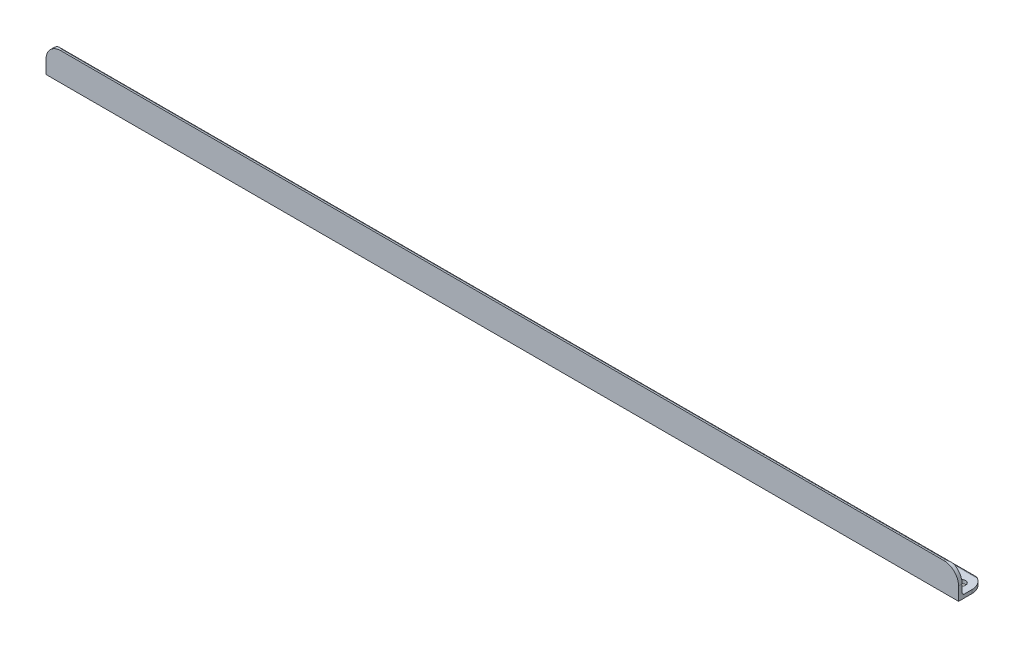
ISO-10303-21;
HEADER;
FILE_DESCRIPTION(('STEP AP214'),'2;1');
FILE_NAME('part.step','',(''),(''),'','','');
FILE_SCHEMA(('AUTOMOTIVE_DESIGN { 1 0 10303 214 1 1 1 1 }'));
ENDSEC;
DATA;
#1=APPLICATION_CONTEXT('core data for automotive mechanical design processes');
#2=APPLICATION_PROTOCOL_DEFINITION('international standard','automotive_design',2000,#1);
#3=PRODUCT_CONTEXT('',#1,'mechanical');
#4=PRODUCT('Part','Part','',(#3));
#5=PRODUCT_RELATED_PRODUCT_CATEGORY('part','',(#4));
#6=PRODUCT_DEFINITION_FORMATION('','',#4);
#7=PRODUCT_DEFINITION_CONTEXT('part definition',#1,'design');
#8=PRODUCT_DEFINITION('design','',#6,#7);
#9=PRODUCT_DEFINITION_SHAPE('','',#8);
#10=(LENGTH_UNIT() NAMED_UNIT(*) SI_UNIT(.MILLI.,.METRE.));
#11=(NAMED_UNIT(*) PLANE_ANGLE_UNIT() SI_UNIT($,.RADIAN.));
#12=(NAMED_UNIT(*) SI_UNIT($,.STERADIAN.) SOLID_ANGLE_UNIT());
#13=UNCERTAINTY_MEASURE_WITH_UNIT(LENGTH_MEASURE(1.E-05),#10,'distance_accuracy_value','');
#14=(GEOMETRIC_REPRESENTATION_CONTEXT(3) GLOBAL_UNCERTAINTY_ASSIGNED_CONTEXT((#13)) GLOBAL_UNIT_ASSIGNED_CONTEXT((#10,
#11,#12)) REPRESENTATION_CONTEXT('',''));
#15=CARTESIAN_POINT('',(0.,0.,0.));
#16=DIRECTION('',(0.,0.,1.));
#17=DIRECTION('',(1.,0.,0.));
#18=AXIS2_PLACEMENT_3D('',#15,#16,#17);
#19=CARTESIAN_POINT('',(0.,-308.926572168843,-687.15));
#20=DIRECTION('',(-1.,0.,0.));
#21=DIRECTION('',(0.,0.,1.));
#22=AXIS2_PLACEMENT_3D('',#19,#20,#21);
#23=CYLINDRICAL_SURFACE('',#22,3.);
#24=CARTESIAN_POINT('',(358.410652388511,-308.926572168843,-690.15));
#25=CARTESIAN_POINT('',(358.410652403078,-308.926437263091,-690.15));
#26=CARTESIAN_POINT('',(358.411226064356,-308.926302357476,-690.149999990929));
#27=CARTESIAN_POINT('',(358.412578827522,-308.925913595122,-690.149999938682));
#28=CARTESIAN_POINT('',(358.413093590989,-308.925659662431,-690.149999872498));
#29=CARTESIAN_POINT('',(358.415295059486,-308.924670176406,-690.149999488983));
#30=CARTESIAN_POINT('',(358.417349493874,-308.923936649768,-690.149998933404));
#31=CARTESIAN_POINT('',(358.425570360576,-308.920923996021,-690.149995544504));
#32=CARTESIAN_POINT('',(358.431292738453,-308.918640485262,-690.149990378275));
#33=CARTESIAN_POINT('',(358.561639886978,-308.866741766351,-690.14981378427));
#34=CARTESIAN_POINT('',(358.692151762047,-308.817186350619,-690.148415798466));
#35=CARTESIAN_POINT('',(358.951954031309,-308.717389544675,-690.143121117783));
#36=CARTESIAN_POINT('',(359.081196543137,-308.667149045249,-690.139187163657));
#37=CARTESIAN_POINT('',(359.334945021709,-308.569018272874,-690.129007200066));
#38=CARTESIAN_POINT('',(359.45941499064,-308.521120051199,-690.122868173072));
#39=CARTESIAN_POINT('',(359.70759930398,-308.425754346051,-690.108293166531));
#40=CARTESIAN_POINT('',(359.831314683702,-308.37828590688,-690.099866430289));
#41=CARTESIAN_POINT('',(360.093725642345,-308.277938610166,-690.079539760976));
#42=CARTESIAN_POINT('',(360.232421041461,-308.225100673362,-690.067342806503));
#43=CARTESIAN_POINT('',(360.509853723203,-308.119880032101,-690.040018251834));
#44=CARTESIAN_POINT('',(360.648590878856,-308.067497903577,-690.024887385659));
#45=CARTESIAN_POINT('',(361.067354590758,-307.910275182757,-689.974769466624));
#46=CARTESIAN_POINT('',(361.347226577094,-307.806397543196,-689.935265634876));
#47=CARTESIAN_POINT('',(361.834467968356,-307.628457333192,-689.855881895473));
#48=CARTESIAN_POINT('',(362.041991690463,-307.553591183282,-689.818705967165));
#49=CARTESIAN_POINT('',(362.456080531994,-307.406466396023,-689.737723339041));
#50=CARTESIAN_POINT('',(362.662646753219,-307.334201779432,-689.693933230144));
#51=CARTESIAN_POINT('',(363.07069936939,-307.194127447148,-689.600624604074));
#52=CARTESIAN_POINT('',(363.272197677177,-307.126254742717,-689.551253048669));
#53=CARTESIAN_POINT('',(363.674679870333,-306.993744234859,-689.445940339067));
#54=CARTESIAN_POINT('',(363.875663369394,-306.929108419204,-689.389995216922));
#55=CARTESIAN_POINT('',(364.402900018081,-306.76425609345,-689.234259299802));
#56=CARTESIAN_POINT('',(364.728551789939,-306.66718840543,-689.128998538735));
#57=CARTESIAN_POINT('',(365.379091554621,-306.485426411079,-688.899945408181));
#58=CARTESIAN_POINT('',(365.703964053806,-306.400807458617,-688.776048682408));
#59=CARTESIAN_POINT('',(366.366800259518,-306.24417125723,-688.50305770582));
#60=CARTESIAN_POINT('',(366.704575158252,-306.173028850699,-688.352993557573));
#61=CARTESIAN_POINT('',(367.374077169076,-306.054326965937,-688.032792518766));
#62=CARTESIAN_POINT('',(367.70581524284,-306.006719525515,-687.86269733351));
#63=CARTESIAN_POINT('',(368.204434472241,-305.957347164322,-687.589032792718));
#64=CARTESIAN_POINT('',(368.374189018764,-305.944546808887,-687.49261098118));
#65=CARTESIAN_POINT('',(368.711200863383,-305.928410432382,-687.294587438534));
#66=CARTESIAN_POINT('',(368.878457566624,-305.925076631092,-687.192984498206));
#67=CARTESIAN_POINT('',(369.208158806163,-305.929287855301,-686.986013812622));
#68=CARTESIAN_POINT('',(369.370634888223,-305.936723309026,-686.880694475626));
#69=CARTESIAN_POINT('',(369.691743724046,-305.96391330731,-686.665878801566));
#70=CARTESIAN_POINT('',(369.850377618847,-305.983664146717,-686.556383730095));
#71=CARTESIAN_POINT('',(370.126286359075,-306.031120332089,-686.360043726743));
#72=CARTESIAN_POINT('',(370.244558090304,-306.05588547665,-686.273889803283));
#73=CARTESIAN_POINT('',(370.477719874666,-306.114773104166,-686.100141447359));
#74=CARTESIAN_POINT('',(370.592609582333,-306.148896539402,-686.012546869149));
#75=CARTESIAN_POINT('',(370.818313625606,-306.227617987433,-685.836631652883));
#76=CARTESIAN_POINT('',(370.929125959732,-306.272221067135,-685.748310683613));
#77=CARTESIAN_POINT('',(371.145603036253,-306.373052177799,-685.572078824085));
#78=CARTESIAN_POINT('',(371.25127030228,-306.429274437167,-685.484167752305));
#79=CARTESIAN_POINT('',(371.487156851712,-306.573443170257,-685.283919720945));
#80=CARTESIAN_POINT('',(371.615222417408,-306.665846422688,-685.172173749267));
#81=CARTESIAN_POINT('',(371.857036078994,-306.87489656912,-684.956112592106));
#82=CARTESIAN_POINT('',(371.970806712981,-306.991504510863,-684.8517858248));
#83=CARTESIAN_POINT('',(372.157570913495,-307.223356857877,-684.677046187799));
#84=CARTESIAN_POINT('',(372.234118351555,-307.333800252626,-684.604100865757));
#85=CARTESIAN_POINT('',(372.372384114512,-307.570422854135,-684.470589218278));
#86=CARTESIAN_POINT('',(372.434118447102,-307.696584848568,-684.410009540655));
#87=CARTESIAN_POINT('',(372.531312371563,-307.941680221377,-684.313718101158));
#88=CARTESIAN_POINT('',(372.569378420279,-308.058624487246,-684.275592750962));
#89=CARTESIAN_POINT('',(372.631013935831,-308.299909681263,-684.213543245217));
#90=CARTESIAN_POINT('',(372.654590224916,-308.424247098184,-684.189612406617));
#91=CARTESIAN_POINT('',(372.686038296547,-308.677395395987,-684.15763653702));
#92=CARTESIAN_POINT('',(372.69385319976,-308.806220778391,-684.149649043071));
#93=CARTESIAN_POINT('',(372.693142090806,-309.063776822499,-684.15037462628));
#94=CARTESIAN_POINT('',(372.684617250559,-309.192507490333,-684.159086505725));
#95=CARTESIAN_POINT('',(372.652737328202,-309.438088279606,-684.191491191099));
#96=CARTESIAN_POINT('',(372.630307466113,-309.555186731039,-684.214249011077));
#97=CARTESIAN_POINT('',(372.572561855696,-309.782838128552,-684.272393109109));
#98=CARTESIAN_POINT('',(372.53724452274,-309.893390267761,-684.307780940122));
#99=CARTESIAN_POINT('',(372.452518696014,-310.11282369889,-684.391831023984));
#100=CARTESIAN_POINT('',(372.402346055281,-310.221133618356,-684.44120426048));
#101=CARTESIAN_POINT('',(372.290964824114,-310.426721795211,-684.549408766332));
#102=CARTESIAN_POINT('',(372.229750646818,-310.523994427112,-684.6082448221));
#103=CARTESIAN_POINT('',(372.063530270281,-310.755091977686,-684.765672849704));
#104=CARTESIAN_POINT('',(371.952392109448,-310.881338729401,-684.868934300186));
#105=CARTESIAN_POINT('',(371.713967028328,-311.108210204874,-685.084784805859));
#106=CARTESIAN_POINT('',(371.586636844829,-311.208764030448,-685.197398558858));
#107=CARTESIAN_POINT('',(371.354926335459,-311.363273130904,-685.396728618486));
#108=CARTESIAN_POINT('',(371.253219418852,-311.422542221842,-685.482540759611));
#109=CARTESIAN_POINT('',(371.044484405506,-311.529500682257,-685.654986566195));
#110=CARTESIAN_POINT('',(370.937453745235,-311.577184406735,-685.741620610853));
#111=CARTESIAN_POINT('',(370.719226623026,-311.66202694939,-685.914465229746));
#112=CARTESIAN_POINT('',(370.608034797295,-311.699197108004,-686.000676160941));
#113=CARTESIAN_POINT('',(370.382101924695,-311.764160987319,-686.172001204354));
#114=CARTESIAN_POINT('',(370.267359679061,-311.791951502521,-686.257114932064));
#115=CARTESIAN_POINT('',(369.962302603241,-311.853870411239,-686.478309858395));
#116=CARTESIAN_POINT('',(369.769568978349,-311.881107288549,-686.61300399145));
#117=CARTESIAN_POINT('',(369.378235858903,-311.917010624679,-686.876262273545));
#118=CARTESIAN_POINT('',(369.17963235408,-311.925664075511,-687.004822067177));
#119=CARTESIAN_POINT('',(368.775212628289,-311.927356030187,-687.256530805755));
#120=CARTESIAN_POINT('',(368.569334767333,-311.920178069093,-687.379580976065));
#121=CARTESIAN_POINT('',(368.15410419042,-311.892305487835,-687.617754008696));
#122=CARTESIAN_POINT('',(367.944752924295,-311.871616375569,-687.73288008019));
#123=CARTESIAN_POINT('',(367.54884540008,-311.822015215753,-687.941493269565));
#124=CARTESIAN_POINT('',(367.362610589803,-311.794407930123,-688.035909877311));
#125=CARTESIAN_POINT('',(366.988320436199,-311.731538493951,-688.218397285762));
#126=CARTESIAN_POINT('',(366.800264813396,-311.696275149908,-688.306467094213));
#127=CARTESIAN_POINT('',(366.233039594414,-311.580382634588,-688.56147247394));
#128=CARTESIAN_POINT('',(365.851547104832,-311.489751159059,-688.718817456627));
#129=CARTESIAN_POINT('',(365.106885771189,-311.294330888179,-688.999656163138));
#130=CARTESIAN_POINT('',(364.743949042076,-311.190679033457,-689.124590821638));
#131=CARTESIAN_POINT('',(364.017765633129,-310.970466753931,-689.351666440848));
#132=CARTESIAN_POINT('',(363.654537311396,-310.853997439628,-689.453954466922));
#133=CARTESIAN_POINT('',(363.11795419168,-310.674912242055,-689.588953946112));
#134=CARTESIAN_POINT('',(362.945310674001,-310.616225219875,-689.62994458119));
#135=CARTESIAN_POINT('',(362.599757440237,-310.496907364971,-689.707165368909));
#136=CARTESIAN_POINT('',(362.426847975724,-310.436277843499,-689.743398652074));
#137=CARTESIAN_POINT('',(362.07672163282,-310.311906414759,-689.811955425279));
#138=CARTESIAN_POINT('',(361.899497430107,-310.248124971491,-689.844169400217));
#139=CARTESIAN_POINT('',(361.544334957157,-310.118911121713,-689.903797952093));
#140=CARTESIAN_POINT('',(361.366396005004,-310.053475021457,-689.931200459458));
#141=CARTESIAN_POINT('',(360.947065848526,-309.897912677902,-689.990009729688));
#142=CARTESIAN_POINT('',(360.70558165208,-309.80727071897,-690.019382685719));
#143=CARTESIAN_POINT('',(360.224753240757,-309.625290191644,-690.069006057065));
#144=CARTESIAN_POINT('',(359.985412485947,-309.533968308325,-690.089346964966));
#145=CARTESIAN_POINT('',(359.639367471432,-309.401198075476,-690.112508530119));
#146=CARTESIAN_POINT('',(359.532666793613,-309.360158268165,-690.118791445283));
#147=CARTESIAN_POINT('',(359.318631287591,-309.277761694333,-690.129664425742));
#148=CARTESIAN_POINT('',(359.211295626394,-309.236404316434,-690.134247647967));
#149=CARTESIAN_POINT('',(358.992482760991,-309.151712687439,-690.141855401777));
#150=CARTESIAN_POINT('',(358.881036615128,-309.108373248849,-690.144800485166));
#151=CARTESIAN_POINT('',(358.657024320895,-309.022301725926,-690.14877750234));
#152=CARTESIAN_POINT('',(358.544498981801,-308.979570118666,-690.149837032045));
#153=CARTESIAN_POINT('',(358.431292328656,-308.9345040992,-690.149990377479));
#154=CARTESIAN_POINT('',(358.425571438987,-308.932220815558,-690.149995543432));
#155=CARTESIAN_POINT('',(358.417350875744,-308.929208219464,-690.149998932981));
#156=CARTESIAN_POINT('',(358.415295876448,-308.928474515067,-690.149999488804));
#157=CARTESIAN_POINT('',(358.413093939953,-308.927484801937,-690.149999872464));
#158=CARTESIAN_POINT('',(358.41257909803,-308.927230821783,-690.149999938669));
#159=CARTESIAN_POINT('',(358.411226094251,-308.92684200122,-690.149999990928));
#160=CARTESIAN_POINT('',(358.410652373943,-308.926707084962,-690.15));
#161=CARTESIAN_POINT('',(358.410652388511,-308.926572168843,-690.15));
#162=B_SPLINE_CURVE_WITH_KNOTS('',3,(#24,#25,#26,#27,#28,#29,#30,#31,#32,#33,#34,#35,#36,#37,
#38,#39,#40,#41,#42,#43,#44,#45,#46,#47,#48,#49,#50,#51,#52,#53,#54,#55,#56,#57,#58,#59,#60,#61,
#62,#63,#64,#65,#66,#67,#68,#69,#70,#71,#72,#73,#74,#75,#76,#77,#78,#79,#80,#81,#82,#83,#84,#85,
#86,#87,#88,#89,#90,#91,#92,#93,#94,#95,#96,#97,#98,#99,#100,#101,#102,#103,#104,#105,#106,#107,
#108,#109,#110,#111,#112,#113,#114,#115,#116,#117,#118,#119,#120,#121,#122,#123,#124,#125,#126,
#127,#128,#129,#130,#131,#132,#133,#134,#135,#136,#137,#138,#139,#140,#141,#142,#143,#144,#145,
#146,#147,#148,#149,#150,#151,#152,#153,#154,#155,#156,#157,#158,#159,#160,#161),.UNSPECIFIED.,
.T.,.F.,(4,2,2,2,2,2,2,2,2,2,2,2,2,2,2,2,2,2,2,2,2,2,2,2,2,2,2,2,2,2,2,2,2,2,2,2,2,2,2,2,2,2,2,
2,2,2,2,2,2,2,2,2,2,2,2,2,2,2,2,2,2,2,2,2,2,2,2,2,4),(0.,0.00111897262247004,
0.00322386861324855,0.00932984699208177,0.0282842787426828,0.440142531292271,0.858194275433495,
1.25822402625803,1.65666094444562,2.10334777312548,2.55053473062719,3.45362390960456,
4.12470043755545,4.79412077470219,5.44883639734342,6.10394927070003,7.17050415261972,
8.24327055996991,9.3713560809866,10.4971330871331,11.0838193100688,11.670643091662,
12.2515380150356,12.8322582571807,13.2771787884219,13.7221446107315,14.1673260183058,
14.6122868202016,15.1908419588384,15.7684731567653,16.2254716633844,16.6819740705134,
17.0666052464716,17.4510551866223,17.8368900562189,18.2226972539558,18.5852412665976,
18.9478298722631,19.3338890208341,19.7201440606358,20.3089315578175,20.8993266494671,
21.3357716851682,21.772428955278,22.208613413939,22.6449467883617,23.3539427355677,
24.063434802671,24.7826879071517,25.5016479868296,26.1332404489956,26.7649314407636,
28.030814646132,29.2227166091871,30.4066353176193,30.967270112202,31.5275341182079,
32.1007266186059,32.6753370457221,33.4540054312126,34.2246858362055,34.568254156307,
34.9131910620057,35.2736546941707,35.6287979934283,35.6477504573857,35.6538579262528,
35.6559632135919,35.6570822721998),.UNSPECIFIED.);
#163=CARTESIAN_POINT('',(358.410652388511,-308.926572168843,-690.15));
#164=VERTEX_POINT('',#163);
#165=CARTESIAN_POINT('',(368.946306141364,-305.926572168843,-687.15));
#166=VERTEX_POINT('',#165);
#167=EDGE_CURVE('E20',#164,#166,#162,.T.);
#168=ORIENTED_EDGE('',*,*,#167,.F.);
#169=DIRECTION('',(1.,0.,0.));
#170=VECTOR('',#169,1.);
#171=CARTESIAN_POINT('',(551.510652388512,-308.926572168843,-690.15));
#172=LINE('',#171,#170);
#173=CARTESIAN_POINT('',(-841.589347611489,-308.926572168843,-690.15));
#174=VERTEX_POINT('',#173);
#175=EDGE_CURVE('E114',#164,#174,#172,.F.);
#176=ORIENTED_EDGE('',*,*,#175,.T.);
#177=CARTESIAN_POINT('',(-852.125001364341,-305.926572168843,-687.15));
#178=CARTESIAN_POINT('',(-851.980523689303,-305.926593927832,-687.239544802268));
#179=CARTESIAN_POINT('',(-851.834934010706,-305.930580149882,-687.327218530262));
#180=CARTESIAN_POINT('',(-851.541903177508,-305.945652741428,-687.498642229495));
#181=CARTESIAN_POINT('',(-851.394462852608,-305.956736033246,-687.582393884673));
#182=CARTESIAN_POINT('',(-851.098307632743,-305.985143769438,-687.745687661886));
#183=CARTESIAN_POINT('',(-850.949596307434,-306.002454259952,-687.825238743088));
#184=CARTESIAN_POINT('',(-850.65079925467,-306.042639486356,-687.980267261151));
#185=CARTESIAN_POINT('',(-850.500713361207,-306.065514903084,-688.055744198182));
#186=CARTESIAN_POINT('',(-850.050432657324,-306.141269133964,-688.275150285857));
#187=CARTESIAN_POINT('',(-849.748478096046,-306.201457201948,-688.413010497239));
#188=CARTESIAN_POINT('',(-849.140948729011,-306.337461214713,-688.672488176594));
#189=CARTESIAN_POINT('',(-848.835371303848,-306.413289210697,-688.794092999329));
#190=CARTESIAN_POINT('',(-848.281332153814,-306.561466145892,-688.999052786955));
#191=CARTESIAN_POINT('',(-848.033324267482,-306.631622001873,-689.085246601784));
#192=CARTESIAN_POINT('',(-847.535931436522,-306.778704483725,-689.247292242855));
#193=CARTESIAN_POINT('',(-847.286546334727,-306.855631897976,-689.323142862262));
#194=CARTESIAN_POINT('',(-846.536631187453,-307.094828778582,-689.535416669956));
#195=CARTESIAN_POINT('',(-846.034377603097,-307.265502838328,-689.656548448174));
#196=CARTESIAN_POINT('',(-845.026401105763,-307.621793186672,-689.859172391863));
#197=CARTESIAN_POINT('',(-844.520673794855,-307.807433992017,-689.940597912084));
#198=CARTESIAN_POINT('',(-843.507876750132,-308.187178141264,-690.064299814318));
#199=CARTESIAN_POINT('',(-843.000807780891,-308.381277362941,-690.106595047997));
#200=CARTESIAN_POINT('',(-842.200969756268,-308.689707563347,-690.142790136486));
#201=CARTESIAN_POINT('',(-841.908338461115,-308.803027999718,-690.14959675308));
#202=CARTESIAN_POINT('',(-841.606931078697,-308.919762120542,-690.149994201872));
#203=CARTESIAN_POINT('',(-841.598139336877,-308.923167147494,-690.149999998869));
#204=CARTESIAN_POINT('',(-841.589347611489,-308.926572168843,-690.15));
#205=B_SPLINE_CURVE_WITH_KNOTS('',3,(#177,#178,#179,#180,#181,#182,#183,#184,#185,#186,#187,
#188,#189,#190,#191,#192,#193,#194,#195,#196,#197,#198,#199,#200,#201,#202,#203,#204),
.UNSPECIFIED.,.F.,.F.,(4,2,2,2,2,2,2,2,2,2,2,2,2,4),(0.,0.509811439879253,1.0194019471399,
1.52785760887057,2.03637550861167,3.04745631522168,4.05931913100958,4.87432922119139,
5.68943432496243,7.31976401305233,8.95282080045219,10.5850904253094,11.5264747571754,
11.5547590337694),.UNSPECIFIED.);
#206=CARTESIAN_POINT('',(-852.125001364341,-305.926572168843,-687.15));
#207=VERTEX_POINT('',#206);
#208=EDGE_CURVE('E130',#207,#174,#205,.T.);
#209=ORIENTED_EDGE('',*,*,#208,.F.);
#210=DIRECTION('',(1.,0.,0.));
#211=VECTOR('',#210,1.);
#212=CARTESIAN_POINT('',(551.510652388512,-305.926572168843,-687.15));
#213=LINE('',#212,#211);
#214=EDGE_CURVE('E117',#207,#166,#213,.T.);
#215=ORIENTED_EDGE('',*,*,#214,.T.);
#216=EDGE_LOOP('',(#168,#176,#209,#215));
#217=FACE_BOUND('',#216,.T.);
#218=ADVANCED_FACE('F16',(#217),#23,.T.);
#219=CARTESIAN_POINT('',(-574.589347611488,-310.689072168843,-671.1));
#220=DIRECTION('',(0.,-1.,0.));
#221=DIRECTION('',(0.,0.,-1.));
#222=AXIS2_PLACEMENT_3D('',#219,#220,#221);
#223=CYLINDRICAL_SURFACE('',#222,3.4);
#224=CARTESIAN_POINT('',(-574.589347611488,-305.926572168843,-671.1));
#225=DIRECTION('',(0.,-1.,0.));
#226=DIRECTION('',(0.,0.,-1.));
#227=AXIS2_PLACEMENT_3D('',#224,#225,#226);
#228=CIRCLE('',#227,3.4);
#229=CARTESIAN_POINT('',(-574.589347611488,-305.926572168843,-674.5));
#230=VERTEX_POINT('',#229);
#231=EDGE_CURVE('E312',#230,#230,#228,.F.);
#232=ORIENTED_EDGE('',*,*,#231,.T.);
#233=EDGE_LOOP('',(#232));
#234=FACE_BOUND('',#233,.T.);
#235=CARTESIAN_POINT('',(-574.589347611488,-310.017902480922,-671.1));
#236=DIRECTION('',(0.,-1.,0.));
#237=DIRECTION('',(-1.,0.,0.));
#238=AXIS2_PLACEMENT_3D('',#235,#236,#237);
#239=CIRCLE('',#238,3.40000000000407);
#240=CARTESIAN_POINT('',(-577.989347611492,-310.017902480922,-671.1));
#241=VERTEX_POINT('',#240);
#242=EDGE_CURVE('E153',#241,#241,#239,.T.);
#243=ORIENTED_EDGE('',*,*,#242,.T.);
#244=EDGE_LOOP('',(#243));
#245=FACE_BOUND('',#244,.T.);
#246=ADVANCED_FACE('F383',(#234,#245),#223,.F.);
#247=CARTESIAN_POINT('',(-777.789347611488,-310.689072168843,-671.1));
#248=DIRECTION('',(0.,-1.,0.));
#249=DIRECTION('',(0.,0.,-1.));
#250=AXIS2_PLACEMENT_3D('',#247,#248,#249);
#251=CYLINDRICAL_SURFACE('',#250,3.4);
#252=CARTESIAN_POINT('',(-777.789347611488,-305.926572168843,-671.1));
#253=DIRECTION('',(0.,-1.,0.));
#254=DIRECTION('',(0.,0.,-1.));
#255=AXIS2_PLACEMENT_3D('',#252,#253,#254);
#256=CIRCLE('',#255,3.4);
#257=CARTESIAN_POINT('',(-777.789347611488,-305.926572168843,-674.5));
#258=VERTEX_POINT('',#257);
#259=EDGE_CURVE('E304',#258,#258,#256,.F.);
#260=ORIENTED_EDGE('',*,*,#259,.T.);
#261=EDGE_LOOP('',(#260));
#262=FACE_BOUND('',#261,.T.);
#263=CARTESIAN_POINT('',(-777.789347611488,-310.017902480865,-671.1));
#264=DIRECTION('',(0.,-1.,0.));
#265=DIRECTION('',(-1.,0.,0.));
#266=AXIS2_PLACEMENT_3D('',#263,#264,#265);
#267=CIRCLE('',#266,3.3999999999853);
#268=CARTESIAN_POINT('',(-781.189347611473,-310.017902480865,-671.1));
#269=VERTEX_POINT('',#268);
#270=EDGE_CURVE('E123',#269,#269,#267,.T.);
#271=ORIENTED_EDGE('',*,*,#270,.T.);
#272=EDGE_LOOP('',(#271));
#273=FACE_BOUND('',#272,.T.);
#274=ADVANCED_FACE('F380',(#262,#273),#251,.F.);
#275=CARTESIAN_POINT('',(363.410652388511,-268.73506976884,-671.1));
#276=DIRECTION('',(0.,-1.,0.));
#277=DIRECTION('',(0.,0.,-1.));
#278=AXIS2_PLACEMENT_3D('',#275,#276,#277);
#279=CYLINDRICAL_SURFACE('',#278,5.5);
#280=CARTESIAN_POINT('',(363.410652388511,-310.689072168843,-671.1));
#281=DIRECTION('',(0.,-1.,0.));
#282=DIRECTION('',(0.,0.,-1.));
#283=AXIS2_PLACEMENT_3D('',#280,#281,#282);
#284=CIRCLE('',#283,5.5);
#285=CARTESIAN_POINT('',(363.410652388511,-310.689072168843,-676.6));
#286=VERTEX_POINT('',#285);
#287=EDGE_CURVE('E147',#286,#286,#284,.T.);
#288=ORIENTED_EDGE('',*,*,#287,.T.);
#289=EDGE_LOOP('',(#288));
#290=FACE_BOUND('',#289,.T.);
#291=CARTESIAN_POINT('',(363.410652388511,-305.926572168843,-671.1));
#292=DIRECTION('',(0.,-1.,0.));
#293=DIRECTION('',(0.,0.,-1.));
#294=AXIS2_PLACEMENT_3D('',#291,#292,#293);
#295=CIRCLE('',#294,5.5);
#296=CARTESIAN_POINT('',(363.410652388511,-305.926572168843,-676.6));
#297=VERTEX_POINT('',#296);
#298=EDGE_CURVE('E318',#297,#297,#295,.F.);
#299=ORIENTED_EDGE('',*,*,#298,.T.);
#300=EDGE_LOOP('',(#299));
#301=FACE_BOUND('',#300,.T.);
#302=ADVANCED_FACE('F376',(#290,#301),#279,.F.);
#303=CARTESIAN_POINT('',(-846.589347611489,-268.73506976884,-671.1));
#304=DIRECTION('',(0.,-1.,0.));
#305=DIRECTION('',(0.,0.,-1.));
#306=AXIS2_PLACEMENT_3D('',#303,#304,#305);
#307=CYLINDRICAL_SURFACE('',#306,5.5);
#308=CARTESIAN_POINT('',(-846.589347611489,-310.689072168843,-671.1));
#309=DIRECTION('',(0.,-1.,0.));
#310=DIRECTION('',(0.,0.,-1.));
#311=AXIS2_PLACEMENT_3D('',#308,#309,#310);
#312=CIRCLE('',#311,5.5);
#313=CARTESIAN_POINT('',(-846.589347611489,-310.689072168843,-676.6));
#314=VERTEX_POINT('',#313);
#315=EDGE_CURVE('E422',#314,#314,#312,.T.);
#316=ORIENTED_EDGE('',*,*,#315,.T.);
#317=EDGE_LOOP('',(#316));
#318=FACE_BOUND('',#317,.T.);
#319=CARTESIAN_POINT('',(-846.589347611489,-305.926572168843,-671.1));
#320=DIRECTION('',(0.,-1.,0.));
#321=DIRECTION('',(0.,0.,-1.));
#322=AXIS2_PLACEMENT_3D('',#319,#320,#321);
#323=CIRCLE('',#322,5.5);
#324=CARTESIAN_POINT('',(-846.589347611489,-305.926572168843,-676.6));
#325=VERTEX_POINT('',#324);
#326=EDGE_CURVE('E326',#325,#325,#323,.F.);
#327=ORIENTED_EDGE('',*,*,#326,.T.);
#328=EDGE_LOOP('',(#327));
#329=FACE_BOUND('',#328,.T.);
#330=ADVANCED_FACE('F372',(#318,#329),#307,.F.);
#331=CARTESIAN_POINT('',(-574.589347611488,-310.689072168827,-671.1));
#332=DIRECTION('',(0.,-1.,0.));
#333=DIRECTION('',(0.,0.,-1.));
#334=AXIS2_PLACEMENT_3D('',#331,#332,#333);
#335=CONICAL_SURFACE('',#334,4.56249999996805,1.04719755120111);
#336=CARTESIAN_POINT('',(-574.589347611488,-310.689072168825,-671.1));
#337=DIRECTION('',(0.,-1.,0.));
#338=DIRECTION('',(0.,0.,-1.));
#339=AXIS2_PLACEMENT_3D('',#336,#337,#338);
#340=CIRCLE('',#339,4.56249999996317);
#341=CARTESIAN_POINT('',(-574.589347611488,-310.689072168825,-675.662499999963));
#342=VERTEX_POINT('',#341);
#343=EDGE_CURVE('E419',#342,#342,#340,.T.);
#344=ORIENTED_EDGE('',*,*,#343,.T.);
#345=EDGE_LOOP('',(#344));
#346=FACE_BOUND('',#345,.T.);
#347=ORIENTED_EDGE('',*,*,#242,.F.);
#348=EDGE_LOOP('',(#347));
#349=FACE_BOUND('',#348,.T.);
#350=ADVANCED_FACE('F368',(#346,#349),#335,.F.);
#351=CARTESIAN_POINT('',(334.610652388511,-268.73506976884,-671.099999999997));
#352=DIRECTION('',(0.,-1.,0.));
#353=DIRECTION('',(0.,0.,-1.));
#354=AXIS2_PLACEMENT_3D('',#351,#352,#353);
#355=CYLINDRICAL_SURFACE('',#354,7.);
#356=CARTESIAN_POINT('',(334.610652388511,-310.689072168843,-671.099999999997));
#357=DIRECTION('',(0.,-1.,0.));
#358=DIRECTION('',(0.,0.,-1.));
#359=AXIS2_PLACEMENT_3D('',#356,#357,#358);
#360=CIRCLE('',#359,7.);
#361=CARTESIAN_POINT('',(334.610652388511,-310.689072168843,-678.099999999997));
#362=VERTEX_POINT('',#361);
#363=EDGE_CURVE('E415',#362,#362,#360,.T.);
#364=ORIENTED_EDGE('',*,*,#363,.T.);
#365=EDGE_LOOP('',(#364));
#366=FACE_BOUND('',#365,.T.);
#367=CARTESIAN_POINT('',(334.610652388511,-305.926572168843,-671.099999999997));
#368=DIRECTION('',(0.,-1.,0.));
#369=DIRECTION('',(0.,0.,-1.));
#370=AXIS2_PLACEMENT_3D('',#367,#368,#369);
#371=CIRCLE('',#370,7.);
#372=CARTESIAN_POINT('',(334.610652388511,-305.926572168843,-678.099999999997));
#373=VERTEX_POINT('',#372);
#374=EDGE_CURVE('E330',#373,#373,#371,.F.);
#375=ORIENTED_EDGE('',*,*,#374,.T.);
#376=EDGE_LOOP('',(#375));
#377=FACE_BOUND('',#376,.T.);
#378=ADVANCED_FACE('F364',(#366,#377),#355,.F.);
#379=CARTESIAN_POINT('',(-777.789347611488,-310.689072168827,-671.1));
#380=DIRECTION('',(0.,-1.,0.));
#381=DIRECTION('',(0.,0.,-1.));
#382=AXIS2_PLACEMENT_3D('',#379,#380,#381);
#383=CONICAL_SURFACE('',#382,4.56250000000613,1.04719755118561);
#384=CARTESIAN_POINT('',(-777.789347611488,-310.689072168835,-671.1));
#385=DIRECTION('',(0.,-1.,0.));
#386=DIRECTION('',(0.,0.,-1.));
#387=AXIS2_PLACEMENT_3D('',#384,#385,#386);
#388=CIRCLE('',#387,4.56250000002001);
#389=CARTESIAN_POINT('',(-777.789347611488,-310.689072168835,-675.66250000002));
#390=VERTEX_POINT('',#389);
#391=EDGE_CURVE('E418',#390,#390,#388,.T.);
#392=ORIENTED_EDGE('',*,*,#391,.T.);
#393=EDGE_LOOP('',(#392));
#394=FACE_BOUND('',#393,.T.);
#395=ORIENTED_EDGE('',*,*,#270,.F.);
#396=EDGE_LOOP('',(#395));
#397=FACE_BOUND('',#396,.T.);
#398=ADVANCED_FACE('F360',(#394,#397),#383,.F.);
#399=CARTESIAN_POINT('',(-817.789347611488,-268.73506976884,-671.1));
#400=DIRECTION('',(0.,-1.,0.));
#401=DIRECTION('',(0.,0.,-1.));
#402=AXIS2_PLACEMENT_3D('',#399,#400,#401);
#403=CYLINDRICAL_SURFACE('',#402,7.);
#404=CARTESIAN_POINT('',(-817.789347611488,-310.689072168843,-671.1));
#405=DIRECTION('',(0.,-1.,0.));
#406=DIRECTION('',(0.,0.,-1.));
#407=AXIS2_PLACEMENT_3D('',#404,#405,#406);
#408=CIRCLE('',#407,7.);
#409=CARTESIAN_POINT('',(-817.789347611488,-310.689072168843,-678.1));
#410=VERTEX_POINT('',#409);
#411=EDGE_CURVE('E279',#410,#410,#408,.T.);
#412=ORIENTED_EDGE('',*,*,#411,.T.);
#413=EDGE_LOOP('',(#412));
#414=FACE_BOUND('',#413,.T.);
#415=CARTESIAN_POINT('',(-817.789347611488,-305.926572168843,-671.1));
#416=DIRECTION('',(0.,-1.,0.));
#417=DIRECTION('',(0.,0.,-1.));
#418=AXIS2_PLACEMENT_3D('',#415,#416,#417);
#419=CIRCLE('',#418,7.);
#420=CARTESIAN_POINT('',(-817.789347611488,-305.926572168843,-678.1));
#421=VERTEX_POINT('',#420);
#422=EDGE_CURVE('E300',#421,#421,#419,.F.);
#423=ORIENTED_EDGE('',*,*,#422,.T.);
#424=EDGE_LOOP('',(#423));
#425=FACE_BOUND('',#424,.T.);
#426=ADVANCED_FACE('F357',(#414,#425),#403,.F.);
#427=CARTESIAN_POINT('',(358.410652388511,-268.779069768843,-670.15));
#428=DIRECTION('',(0.,-1.,0.));
#429=DIRECTION('',(0.,0.,-1.));
#430=AXIS2_PLACEMENT_3D('',#427,#428,#429);
#431=CYLINDRICAL_SURFACE('',#430,20.);
#432=CARTESIAN_POINT('',(358.410652388511,-310.689072168843,-670.15));
#433=DIRECTION('',(0.,-1.,0.));
#434=DIRECTION('',(0.,0.,-1.));
#435=AXIS2_PLACEMENT_3D('',#432,#433,#434);
#436=CIRCLE('',#435,20.);
#437=CARTESIAN_POINT('',(378.410652388511,-310.689072168843,-670.15));
#438=VERTEX_POINT('',#437);
#439=CARTESIAN_POINT('',(358.410652388511,-310.689072168843,-690.15));
#440=VERTEX_POINT('',#439);
#441=EDGE_CURVE('E135',#438,#440,#436,.F.);
#442=ORIENTED_EDGE('',*,*,#441,.T.);
#443=DIRECTION('',(0.,1.,0.));
#444=VECTOR('',#443,1.);
#445=CARTESIAN_POINT('',(358.410652388511,-305.926572168843,-690.15));
#446=LINE('',#445,#444);
#447=EDGE_CURVE('E122',#440,#164,#446,.T.);
#448=ORIENTED_EDGE('',*,*,#447,.T.);
#449=ORIENTED_EDGE('',*,*,#167,.T.);
#450=CARTESIAN_POINT('',(358.410652388511,-305.926572168843,-670.15));
#451=DIRECTION('',(0.,-1.,0.));
#452=DIRECTION('',(0.,0.,-1.));
#453=AXIS2_PLACEMENT_3D('',#450,#451,#452);
#454=CIRCLE('',#453,20.);
#455=CARTESIAN_POINT('',(378.410652388511,-305.926572168843,-670.15));
#456=VERTEX_POINT('',#455);
#457=EDGE_CURVE('E294',#166,#456,#454,.T.);
#458=ORIENTED_EDGE('',*,*,#457,.T.);
#459=DIRECTION('',(0.,1.,0.));
#460=VECTOR('',#459,1.);
#461=CARTESIAN_POINT('',(378.410652388511,-135.433962855661,-670.15));
#462=LINE('',#461,#460);
#463=EDGE_CURVE('E144',#438,#456,#462,.T.);
#464=ORIENTED_EDGE('',*,*,#463,.F.);
#465=EDGE_LOOP('',(#442,#448,#449,#458,#464));
#466=FACE_BOUND('',#465,.T.);
#467=ADVANCED_FACE('F133',(#466),#431,.T.);
#468=CARTESIAN_POINT('',(551.510652388512,-305.926572168843,-690.15));
#469=DIRECTION('',(0.,0.,1.));
#470=DIRECTION('',(1.,0.,0.));
#471=AXIS2_PLACEMENT_3D('',#468,#469,#470);
#472=PLANE('',#471);
#473=ORIENTED_EDGE('',*,*,#175,.F.);
#474=ORIENTED_EDGE('',*,*,#447,.F.);
#475=DIRECTION('',(1.,0.,0.));
#476=VECTOR('',#475,1.);
#477=CARTESIAN_POINT('',(551.510652388512,-310.689072168843,-690.15));
#478=LINE('',#477,#476);
#479=CARTESIAN_POINT('',(-841.589347611489,-310.689072168843,-690.15));
#480=VERTEX_POINT('',#479);
#481=EDGE_CURVE('E271',#440,#480,#478,.F.);
#482=ORIENTED_EDGE('',*,*,#481,.T.);
#483=DIRECTION('',(0.,-1.,0.));
#484=VECTOR('',#483,1.);
#485=CARTESIAN_POINT('',(-841.589347611489,-268.779069768843,-690.15));
#486=LINE('',#485,#484);
#487=EDGE_CURVE('E128',#174,#480,#486,.T.);
#488=ORIENTED_EDGE('',*,*,#487,.F.);
#489=EDGE_LOOP('',(#473,#474,#482,#488));
#490=FACE_BOUND('',#489,.T.);
#491=ADVANCED_FACE('F125',(#490),#472,.F.);
#492=CARTESIAN_POINT('',(-841.589347611489,-268.779069768843,-670.15));
#493=DIRECTION('',(0.,-1.,0.));
#494=DIRECTION('',(0.,0.,-1.));
#495=AXIS2_PLACEMENT_3D('',#492,#493,#494);
#496=CYLINDRICAL_SURFACE('',#495,20.);
#497=ORIENTED_EDGE('',*,*,#208,.T.);
#498=ORIENTED_EDGE('',*,*,#487,.T.);
#499=CARTESIAN_POINT('',(-841.589347611489,-310.689072168843,-670.15));
#500=DIRECTION('',(0.,-1.,0.));
#501=DIRECTION('',(0.,0.,-1.));
#502=AXIS2_PLACEMENT_3D('',#499,#500,#501);
#503=CIRCLE('',#502,20.);
#504=CARTESIAN_POINT('',(-861.589347611488,-310.689072168843,-670.15));
#505=VERTEX_POINT('',#504);
#506=EDGE_CURVE('E274',#480,#505,#503,.F.);
#507=ORIENTED_EDGE('',*,*,#506,.T.);
#508=DIRECTION('',(0.,1.,0.));
#509=VECTOR('',#508,1.);
#510=CARTESIAN_POINT('',(-861.589347611488,-310.689072168843,-670.15));
#511=LINE('',#510,#509);
#512=CARTESIAN_POINT('',(-861.589347611488,-305.926572168843,-670.15));
#513=VERTEX_POINT('',#512);
#514=EDGE_CURVE('E261',#513,#505,#511,.F.);
#515=ORIENTED_EDGE('',*,*,#514,.F.);
#516=CARTESIAN_POINT('',(-841.589347611489,-305.926572168843,-670.15));
#517=DIRECTION('',(0.,-1.,0.));
#518=DIRECTION('',(0.,0.,-1.));
#519=AXIS2_PLACEMENT_3D('',#516,#517,#518);
#520=CIRCLE('',#519,20.);
#521=EDGE_CURVE('E295',#513,#207,#520,.T.);
#522=ORIENTED_EDGE('',*,*,#521,.T.);
#523=EDGE_LOOP('',(#497,#498,#507,#515,#522));
#524=FACE_BOUND('',#523,.T.);
#525=ADVANCED_FACE('F346',(#524),#496,.T.);
#526=CARTESIAN_POINT('',(0.,-302.926572168843,-659.8125));
#527=DIRECTION('',(-1.,0.,0.));
#528=DIRECTION('',(0.,0.,1.));
#529=AXIS2_PLACEMENT_3D('',#526,#527,#528);
#530=CYLINDRICAL_SURFACE('',#529,3.);
#531=CARTESIAN_POINT('',(-861.589347611488,-302.926572168843,-659.8125));
#532=DIRECTION('',(-1.,0.,0.));
#533=DIRECTION('',(0.,0.,1.));
#534=AXIS2_PLACEMENT_3D('',#531,#532,#533);
#535=CIRCLE('',#534,3.);
#536=CARTESIAN_POINT('',(-861.589347611488,-302.926572168843,-656.8125));
#537=VERTEX_POINT('',#536);
#538=CARTESIAN_POINT('',(-861.589347611488,-305.926572168843,-659.8125));
#539=VERTEX_POINT('',#538);
#540=EDGE_CURVE('E200',#537,#539,#535,.F.);
#541=ORIENTED_EDGE('',*,*,#540,.F.);
#542=DIRECTION('',(1.,0.,0.));
#543=VECTOR('',#542,1.);
#544=CARTESIAN_POINT('',(551.510652388512,-302.926572168843,-656.8125));
#545=LINE('',#544,#543);
#546=CARTESIAN_POINT('',(378.410652388511,-302.926572168843,-656.8125));
#547=VERTEX_POINT('',#546);
#548=EDGE_CURVE('E291',#537,#547,#545,.T.);
#549=ORIENTED_EDGE('',*,*,#548,.T.);
#550=CARTESIAN_POINT('',(378.410652388511,-302.926572168843,-659.8125));
#551=DIRECTION('',(-1.,0.,0.));
#552=DIRECTION('',(0.,0.,1.));
#553=AXIS2_PLACEMENT_3D('',#550,#551,#552);
#554=CIRCLE('',#553,3.);
#555=CARTESIAN_POINT('',(378.410652388511,-305.926572168843,-659.8125));
#556=VERTEX_POINT('',#555);
#557=EDGE_CURVE('E284',#556,#547,#554,.T.);
#558=ORIENTED_EDGE('',*,*,#557,.F.);
#559=DIRECTION('',(1.,0.,0.));
#560=VECTOR('',#559,1.);
#561=CARTESIAN_POINT('',(551.510652388512,-305.926572168843,-659.8125));
#562=LINE('',#561,#560);
#563=EDGE_CURVE('E296',#556,#539,#562,.F.);
#564=ORIENTED_EDGE('',*,*,#563,.T.);
#565=EDGE_LOOP('',(#541,#549,#558,#564));
#566=FACE_BOUND('',#565,.T.);
#567=ADVANCED_FACE('F351',(#566),#530,.F.);
#568=CARTESIAN_POINT('',(551.510652388512,-305.926572168843,-656.8125));
#569=DIRECTION('',(0.,-1.,0.));
#570=DIRECTION('',(0.,0.,-1.));
#571=AXIS2_PLACEMENT_3D('',#568,#569,#570);
#572=PLANE('',#571);
#573=ORIENTED_EDGE('',*,*,#259,.F.);
#574=EDGE_LOOP('',(#573));
#575=FACE_BOUND('',#574,.T.);
#576=ORIENTED_EDGE('',*,*,#231,.F.);
#577=EDGE_LOOP('',(#576));
#578=FACE_BOUND('',#577,.T.);
#579=ORIENTED_EDGE('',*,*,#298,.F.);
#580=EDGE_LOOP('',(#579));
#581=FACE_BOUND('',#580,.T.);
#582=ORIENTED_EDGE('',*,*,#326,.F.);
#583=EDGE_LOOP('',(#582));
#584=FACE_BOUND('',#583,.T.);
#585=ORIENTED_EDGE('',*,*,#374,.F.);
#586=EDGE_LOOP('',(#585));
#587=FACE_BOUND('',#586,.T.);
#588=ORIENTED_EDGE('',*,*,#422,.F.);
#589=EDGE_LOOP('',(#588));
#590=FACE_BOUND('',#589,.T.);
#591=DIRECTION('',(0.,0.,-1.));
#592=VECTOR('',#591,1.);
#593=CARTESIAN_POINT('',(378.410652388511,-305.926572168843,-701.3));
#594=LINE('',#593,#592);
#595=EDGE_CURVE('E285',#456,#556,#594,.F.);
#596=ORIENTED_EDGE('',*,*,#595,.F.);
#597=ORIENTED_EDGE('',*,*,#457,.F.);
#598=ORIENTED_EDGE('',*,*,#214,.F.);
#599=ORIENTED_EDGE('',*,*,#521,.F.);
#600=DIRECTION('',(0.,0.,1.));
#601=VECTOR('',#600,1.);
#602=CARTESIAN_POINT('',(-861.589347611488,-305.926572168843,-793.95));
#603=LINE('',#602,#601);
#604=EDGE_CURVE('E199',#539,#513,#603,.F.);
#605=ORIENTED_EDGE('',*,*,#604,.F.);
#606=ORIENTED_EDGE('',*,*,#563,.F.);
#607=EDGE_LOOP('',(#596,#597,#598,#599,#605,#606));
#608=FACE_BOUND('',#607,.T.);
#609=ADVANCED_FACE('F393',(#575,#578,#581,#584,#587,#590,#608),#572,.F.);
#610=CARTESIAN_POINT('',(551.510652388512,-272.589072168843,-656.8125));
#611=DIRECTION('',(0.,0.,1.));
#612=DIRECTION('',(1.,0.,0.));
#613=AXIS2_PLACEMENT_3D('',#610,#611,#612);
#614=PLANE('',#613);
#615=DIRECTION('',(0.,1.,0.));
#616=VECTOR('',#615,1.);
#617=CARTESIAN_POINT('',(378.410652388511,-135.433962855661,-656.8125));
#618=LINE('',#617,#616);
#619=CARTESIAN_POINT('',(378.410652388511,-292.589072168843,-656.8125));
#620=VERTEX_POINT('',#619);
#621=EDGE_CURVE('E148',#547,#620,#618,.T.);
#622=ORIENTED_EDGE('',*,*,#621,.F.);
#623=ORIENTED_EDGE('',*,*,#548,.F.);
#624=DIRECTION('',(0.,1.,0.));
#625=VECTOR('',#624,1.);
#626=CARTESIAN_POINT('',(-861.589347611488,-310.689072168843,-656.8125));
#627=LINE('',#626,#625);
#628=CARTESIAN_POINT('',(-861.589347611489,-292.589072168843,-656.8125));
#629=VERTEX_POINT('',#628);
#630=EDGE_CURVE('E254',#629,#537,#627,.F.);
#631=ORIENTED_EDGE('',*,*,#630,.F.);
#632=CARTESIAN_POINT('',(-841.589347611489,-292.589072168843,-656.8125));
#633=DIRECTION('',(0.,0.,1.));
#634=DIRECTION('',(1.,0.,0.));
#635=AXIS2_PLACEMENT_3D('',#632,#633,#634);
#636=CIRCLE('',#635,20.);
#637=CARTESIAN_POINT('',(-852.125001364341,-275.589072168843,-656.8125));
#638=VERTEX_POINT('',#637);
#639=EDGE_CURVE('E198',#638,#629,#636,.T.);
#640=ORIENTED_EDGE('',*,*,#639,.F.);
#641=DIRECTION('',(1.,0.,0.));
#642=VECTOR('',#641,1.);
#643=CARTESIAN_POINT('',(0.,-275.589072168843,-656.8125));
#644=LINE('',#643,#642);
#645=CARTESIAN_POINT('',(368.946306141364,-275.589072168843,-656.8125));
#646=VERTEX_POINT('',#645);
#647=EDGE_CURVE('E287',#646,#638,#644,.F.);
#648=ORIENTED_EDGE('',*,*,#647,.F.);
#649=CARTESIAN_POINT('',(358.410652388511,-292.589072168843,-656.8125));
#650=DIRECTION('',(0.,0.,1.));
#651=DIRECTION('',(1.,0.,0.));
#652=AXIS2_PLACEMENT_3D('',#649,#650,#651);
#653=CIRCLE('',#652,20.);
#654=EDGE_CURVE('E171',#620,#646,#653,.T.);
#655=ORIENTED_EDGE('',*,*,#654,.F.);
#656=EDGE_LOOP('',(#622,#623,#631,#640,#648,#655));
#657=FACE_BOUND('',#656,.T.);
#658=ADVANCED_FACE('F183',(#657),#614,.F.);
#659=CARTESIAN_POINT('',(0.,-275.589072168843,-653.8125));
#660=DIRECTION('',(1.,0.,0.));
#661=DIRECTION('',(0.,0.,-1.));
#662=AXIS2_PLACEMENT_3D('',#659,#660,#661);
#663=CYLINDRICAL_SURFACE('',#662,3.);
#664=CARTESIAN_POINT('',(368.946306141364,-275.589072168843,-656.8125));
#665=CARTESIAN_POINT('',(368.801828466328,-275.499527366577,-656.812478241011));
#666=CARTESIAN_POINT('',(368.656238787733,-275.411853638583,-656.808492018961));
#667=CARTESIAN_POINT('',(368.363207954539,-275.240429939353,-656.793419427415));
#668=CARTESIAN_POINT('',(368.21576762964,-275.156678284176,-656.782336135598));
#669=CARTESIAN_POINT('',(367.919612409779,-274.993384506965,-656.753928399406));
#670=CARTESIAN_POINT('',(367.770901084471,-274.913833425763,-656.736617908892));
#671=CARTESIAN_POINT('',(367.47210403171,-274.758804907701,-656.696432682489));
#672=CARTESIAN_POINT('',(367.322018138249,-274.683327970671,-656.673557265762));
#673=CARTESIAN_POINT('',(366.871737434364,-274.463921882995,-656.597803034882));
#674=CARTESIAN_POINT('',(366.569782873083,-274.326061671611,-656.537614966898));
#675=CARTESIAN_POINT('',(365.962253506041,-274.066583992252,-656.401610954132));
#676=CARTESIAN_POINT('',(365.656676080875,-273.944979169515,-656.325782958147));
#677=CARTESIAN_POINT('',(365.102636930837,-273.740019381888,-656.177606022951));
#678=CARTESIAN_POINT('',(364.854629044505,-273.65382556706,-656.10745016697));
#679=CARTESIAN_POINT('',(364.357236213544,-273.491779925987,-655.960367685118));
#680=CARTESIAN_POINT('',(364.107851111748,-273.415929306581,-655.883440270866));
#681=CARTESIAN_POINT('',(363.357935964471,-273.203655498887,-655.644243390261));
#682=CARTESIAN_POINT('',(362.855682380112,-273.082523720667,-655.47356933052));
#683=CARTESIAN_POINT('',(361.847705882782,-272.879899776979,-655.117278982162));
#684=CARTESIAN_POINT('',(361.341978571882,-272.798474256758,-654.931638176799));
#685=CARTESIAN_POINT('',(360.329181527143,-272.674772354525,-654.551894027603));
#686=CARTESIAN_POINT('',(359.822112557876,-272.632477120846,-654.357794805997));
#687=CARTESIAN_POINT('',(359.022274533313,-272.596282032357,-654.049364605441));
#688=CARTESIAN_POINT('',(358.729643238201,-272.589475415763,-653.93604416896));
#689=CARTESIAN_POINT('',(358.428235855723,-272.589077966971,-653.819310048292));
#690=CARTESIAN_POINT('',(358.419444113901,-272.589072169974,-653.815905021344));
#691=CARTESIAN_POINT('',(358.410652388511,-272.589072168843,-653.8125));
#692=B_SPLINE_CURVE_WITH_KNOTS('',3,(#664,#665,#666,#667,#668,#669,#670,#671,#672,#673,#674,
#675,#676,#677,#678,#679,#680,#681,#682,#683,#684,#685,#686,#687,#688,#689,#690,#691),
.UNSPECIFIED.,.F.,.F.,(4,2,2,2,2,2,2,2,2,2,2,2,2,4),(0.,0.509811439872908,1.01940194712723,
1.52785760885277,2.03637550858859,3.04745631521061,4.05931913100915,4.87432922119222,
5.68943432496466,7.31976401306062,8.95282080045682,10.585090425308,11.5264747571761,
11.5547590337703),.UNSPECIFIED.);
#693=CARTESIAN_POINT('',(358.410652388511,-272.589072168843,-653.8125));
#694=VERTEX_POINT('',#693);
#695=EDGE_CURVE('E162',#646,#694,#692,.T.);
#696=ORIENTED_EDGE('',*,*,#695,.F.);
#697=ORIENTED_EDGE('',*,*,#647,.T.);
#698=CARTESIAN_POINT('',(-852.125001364341,-275.589072168843,-656.8125));
#699=CARTESIAN_POINT('',(-851.980523689305,-275.499527366576,-656.812478241011));
#700=CARTESIAN_POINT('',(-851.83493401071,-275.411853638583,-656.808492018961));
#701=CARTESIAN_POINT('',(-851.541903177516,-275.240429939352,-656.793419427415));
#702=CARTESIAN_POINT('',(-851.394462852617,-275.156678284176,-656.782336135598));
#703=CARTESIAN_POINT('',(-851.098307632756,-274.993384506964,-656.753928399406));
#704=CARTESIAN_POINT('',(-850.949596307448,-274.913833425762,-656.736617908892));
#705=CARTESIAN_POINT('',(-850.650799254687,-274.7588049077,-656.696432682489));
#706=CARTESIAN_POINT('',(-850.500713361226,-274.683327970671,-656.673557265762));
#707=CARTESIAN_POINT('',(-850.050432657341,-274.463921882994,-656.597803034882));
#708=CARTESIAN_POINT('',(-849.74847809606,-274.32606167161,-656.537614966898));
#709=CARTESIAN_POINT('',(-849.140948729018,-274.066583992252,-656.401610954131));
#710=CARTESIAN_POINT('',(-848.835371303852,-273.944979169515,-656.325782958146));
#711=CARTESIAN_POINT('',(-848.281332153813,-273.740019381888,-656.17760602295));
#712=CARTESIAN_POINT('',(-848.033324267481,-273.653825567059,-656.107450166969));
#713=CARTESIAN_POINT('',(-847.53593143652,-273.491779925987,-655.960367685117));
#714=CARTESIAN_POINT('',(-847.286546334725,-273.415929306581,-655.883440270865));
#715=CARTESIAN_POINT('',(-846.536631187447,-273.203655498886,-655.644243390261));
#716=CARTESIAN_POINT('',(-846.034377603088,-273.082523720667,-655.47356933052));
#717=CARTESIAN_POINT('',(-845.026401105758,-272.879899776979,-655.117278982161));
#718=CARTESIAN_POINT('',(-844.520673794858,-272.798474256758,-654.931638176798));
#719=CARTESIAN_POINT('',(-843.507876750119,-272.674772354524,-654.551894027603));
#720=CARTESIAN_POINT('',(-843.000807780852,-272.632477120846,-654.357794805996));
#721=CARTESIAN_POINT('',(-842.200969756289,-272.596282032357,-654.04936460544));
#722=CARTESIAN_POINT('',(-841.908338461179,-272.589475415763,-653.93604416896));
#723=CARTESIAN_POINT('',(-841.606931078701,-272.589077966971,-653.819310048292));
#724=CARTESIAN_POINT('',(-841.598139336879,-272.589072169974,-653.815905021344));
#725=CARTESIAN_POINT('',(-841.589347611489,-272.589072168843,-653.8125));
#726=B_SPLINE_CURVE_WITH_KNOTS('',3,(#698,#699,#700,#701,#702,#703,#704,#705,#706,#707,#708,
#709,#710,#711,#712,#713,#714,#715,#716,#717,#718,#719,#720,#721,#722,#723,#724,#725),
.UNSPECIFIED.,.F.,.F.,(4,2,2,2,2,2,2,2,2,2,2,2,2,4),(0.,0.509811439872832,1.01940194712732,
1.52785760885295,2.0363755085888,3.04745631521093,4.0593191310097,4.87432922119283,
5.68943432496545,7.31976401306144,8.95282080045782,10.5850904253092,11.5264747571751,
11.5547590337694),.UNSPECIFIED.);
#727=CARTESIAN_POINT('',(-841.589347611488,-272.589072168843,-653.8125));
#728=VERTEX_POINT('',#727);
#729=EDGE_CURVE('E189',#728,#638,#726,.F.);
#730=ORIENTED_EDGE('',*,*,#729,.F.);
#731=DIRECTION('',(1.,0.,0.));
#732=VECTOR('',#731,1.);
#733=CARTESIAN_POINT('',(551.510652388512,-272.589072168843,-653.8125));
#734=LINE('',#733,#732);
#735=EDGE_CURVE('E241',#728,#694,#734,.T.);
#736=ORIENTED_EDGE('',*,*,#735,.T.);
#737=EDGE_LOOP('',(#696,#697,#730,#736));
#738=FACE_BOUND('',#737,.T.);
#739=ADVANCED_FACE('F177',(#738),#663,.T.);
#740=CARTESIAN_POINT('',(378.410652388511,-135.433962855661,-701.3));
#741=DIRECTION('',(1.,0.,0.));
#742=DIRECTION('',(0.,0.,-1.));
#743=AXIS2_PLACEMENT_3D('',#740,#741,#742);
#744=PLANE('',#743);
#745=DIRECTION('',(0.,0.,1.));
#746=VECTOR('',#745,1.);
#747=CARTESIAN_POINT('',(378.410652388511,-310.689072168843,-690.15));
#748=LINE('',#747,#746);
#749=CARTESIAN_POINT('',(378.410652388511,-310.689072168843,-652.05));
#750=VERTEX_POINT('',#749);
#751=EDGE_CURVE('E275',#750,#438,#748,.F.);
#752=ORIENTED_EDGE('',*,*,#751,.T.);
#753=ORIENTED_EDGE('',*,*,#463,.T.);
#754=ORIENTED_EDGE('',*,*,#595,.T.);
#755=ORIENTED_EDGE('',*,*,#557,.T.);
#756=ORIENTED_EDGE('',*,*,#621,.T.);
#757=DIRECTION('',(0.,0.,1.));
#758=VECTOR('',#757,1.);
#759=CARTESIAN_POINT('',(378.410652388511,-292.589072168843,-694.0040024));
#760=LINE('',#759,#758);
#761=CARTESIAN_POINT('',(378.410652388511,-292.589072168843,-652.05));
#762=VERTEX_POINT('',#761);
#763=EDGE_CURVE('E412',#762,#620,#760,.F.);
#764=ORIENTED_EDGE('',*,*,#763,.F.);
#765=DIRECTION('',(0.,1.,0.));
#766=VECTOR('',#765,1.);
#767=CARTESIAN_POINT('',(378.410652388511,-310.689072168843,-652.05));
#768=LINE('',#767,#766);
#769=EDGE_CURVE('E268',#762,#750,#768,.F.);
#770=ORIENTED_EDGE('',*,*,#769,.T.);
#771=EDGE_LOOP('',(#752,#753,#754,#755,#756,#764,#770));
#772=FACE_BOUND('',#771,.T.);
#773=ADVANCED_FACE('F182',(#772),#744,.T.);
#774=CARTESIAN_POINT('',(551.510652388512,-310.689072168843,-690.15));
#775=DIRECTION('',(0.,1.,0.));
#776=DIRECTION('',(0.,0.,1.));
#777=AXIS2_PLACEMENT_3D('',#774,#775,#776);
#778=PLANE('',#777);
#779=DIRECTION('',(0.,0.,1.));
#780=VECTOR('',#779,1.);
#781=CARTESIAN_POINT('',(-861.589347611488,-310.689072168843,-793.95));
#782=LINE('',#781,#780);
#783=CARTESIAN_POINT('',(-861.589347611488,-310.689072168843,-652.05));
#784=VERTEX_POINT('',#783);
#785=EDGE_CURVE('E257',#505,#784,#782,.T.);
#786=ORIENTED_EDGE('',*,*,#785,.F.);
#787=ORIENTED_EDGE('',*,*,#506,.F.);
#788=ORIENTED_EDGE('',*,*,#481,.F.);
#789=ORIENTED_EDGE('',*,*,#441,.F.);
#790=ORIENTED_EDGE('',*,*,#751,.F.);
#791=DIRECTION('',(-1.,0.,0.));
#792=VECTOR('',#791,1.);
#793=CARTESIAN_POINT('',(551.510652388512,-310.689072168843,-652.05));
#794=LINE('',#793,#792);
#795=EDGE_CURVE('E264',#750,#784,#794,.T.);
#796=ORIENTED_EDGE('',*,*,#795,.T.);
#797=EDGE_LOOP('',(#786,#787,#788,#789,#790,#796));
#798=FACE_BOUND('',#797,.T.);
#799=ORIENTED_EDGE('',*,*,#411,.F.);
#800=EDGE_LOOP('',(#799));
#801=FACE_BOUND('',#800,.T.);
#802=ORIENTED_EDGE('',*,*,#391,.F.);
#803=EDGE_LOOP('',(#802));
#804=FACE_BOUND('',#803,.T.);
#805=ORIENTED_EDGE('',*,*,#363,.F.);
#806=EDGE_LOOP('',(#805));
#807=FACE_BOUND('',#806,.T.);
#808=ORIENTED_EDGE('',*,*,#343,.F.);
#809=EDGE_LOOP('',(#808));
#810=FACE_BOUND('',#809,.T.);
#811=ORIENTED_EDGE('',*,*,#315,.F.);
#812=EDGE_LOOP('',(#811));
#813=FACE_BOUND('',#812,.T.);
#814=ORIENTED_EDGE('',*,*,#287,.F.);
#815=EDGE_LOOP('',(#814));
#816=FACE_BOUND('',#815,.T.);
#817=ADVANCED_FACE('F210',(#798,#801,#804,#807,#810,#813,#816),#778,.F.);
#818=CARTESIAN_POINT('',(-861.589347611488,-310.689072168843,-793.95));
#819=DIRECTION('',(-1.,0.,0.));
#820=DIRECTION('',(0.,0.,1.));
#821=AXIS2_PLACEMENT_3D('',#818,#819,#820);
#822=PLANE('',#821);
#823=ORIENTED_EDGE('',*,*,#540,.T.);
#824=ORIENTED_EDGE('',*,*,#604,.T.);
#825=ORIENTED_EDGE('',*,*,#514,.T.);
#826=ORIENTED_EDGE('',*,*,#785,.T.);
#827=DIRECTION('',(0.,1.,0.));
#828=VECTOR('',#827,1.);
#829=CARTESIAN_POINT('',(-861.589347611488,-310.689072168843,-652.05));
#830=LINE('',#829,#828);
#831=CARTESIAN_POINT('',(-861.589347611489,-292.589072168843,-652.05));
#832=VERTEX_POINT('',#831);
#833=EDGE_CURVE('E161',#784,#832,#830,.T.);
#834=ORIENTED_EDGE('',*,*,#833,.T.);
#835=DIRECTION('',(0.,0.,1.));
#836=VECTOR('',#835,1.);
#837=CARTESIAN_POINT('',(-861.589347611489,-292.589072168843,-694.0040024));
#838=LINE('',#837,#836);
#839=EDGE_CURVE('E236',#629,#832,#838,.T.);
#840=ORIENTED_EDGE('',*,*,#839,.F.);
#841=ORIENTED_EDGE('',*,*,#630,.T.);
#842=EDGE_LOOP('',(#823,#824,#825,#826,#834,#840,#841));
#843=FACE_BOUND('',#842,.T.);
#844=ADVANCED_FACE('F207',(#843),#822,.T.);
#845=CARTESIAN_POINT('',(-841.589347611489,-292.589072168843,-694.0040024));
#846=DIRECTION('',(0.,0.,1.));
#847=DIRECTION('',(1.,0.,0.));
#848=AXIS2_PLACEMENT_3D('',#845,#846,#847);
#849=CYLINDRICAL_SURFACE('',#848,20.);
#850=ORIENTED_EDGE('',*,*,#639,.T.);
#851=ORIENTED_EDGE('',*,*,#839,.T.);
#852=CARTESIAN_POINT('',(-841.589347611489,-292.589072168843,-652.05));
#853=DIRECTION('',(0.,0.,1.));
#854=DIRECTION('',(1.,0.,0.));
#855=AXIS2_PLACEMENT_3D('',#852,#853,#854);
#856=CIRCLE('',#855,20.);
#857=CARTESIAN_POINT('',(-841.589347611489,-272.589072168843,-652.05));
#858=VERTEX_POINT('',#857);
#859=EDGE_CURVE('E157',#832,#858,#856,.F.);
#860=ORIENTED_EDGE('',*,*,#859,.T.);
#861=DIRECTION('',(0.,0.,-1.));
#862=VECTOR('',#861,1.);
#863=CARTESIAN_POINT('',(-841.589347611488,-272.589072168843,-652.05));
#864=LINE('',#863,#862);
#865=EDGE_CURVE('E234',#858,#728,#864,.T.);
#866=ORIENTED_EDGE('',*,*,#865,.T.);
#867=ORIENTED_EDGE('',*,*,#729,.T.);
#868=EDGE_LOOP('',(#850,#851,#860,#866,#867));
#869=FACE_BOUND('',#868,.T.);
#870=ADVANCED_FACE('F202',(#869),#849,.T.);
#871=CARTESIAN_POINT('',(551.510652388512,-272.589072168843,-652.05));
#872=DIRECTION('',(0.,-1.,0.));
#873=DIRECTION('',(0.,0.,-1.));
#874=AXIS2_PLACEMENT_3D('',#871,#872,#873);
#875=PLANE('',#874);
#876=DIRECTION('',(-1.,0.,0.));
#877=VECTOR('',#876,1.);
#878=CARTESIAN_POINT('',(551.510652388512,-272.589072168843,-652.05));
#879=LINE('',#878,#877);
#880=CARTESIAN_POINT('',(358.410652388511,-272.589072168843,-652.05));
#881=VERTEX_POINT('',#880);
#882=EDGE_CURVE('E32',#858,#881,#879,.F.);
#883=ORIENTED_EDGE('',*,*,#882,.T.);
#884=DIRECTION('',(0.,0.,1.));
#885=VECTOR('',#884,1.);
#886=CARTESIAN_POINT('',(358.410652388511,-272.589072168843,-694.0040024));
#887=LINE('',#886,#885);
#888=EDGE_CURVE('E40',#694,#881,#887,.T.);
#889=ORIENTED_EDGE('',*,*,#888,.F.);
#890=ORIENTED_EDGE('',*,*,#735,.F.);
#891=ORIENTED_EDGE('',*,*,#865,.F.);
#892=EDGE_LOOP('',(#883,#889,#890,#891));
#893=FACE_BOUND('',#892,.T.);
#894=ADVANCED_FACE('F206',(#893),#875,.F.);
#895=CARTESIAN_POINT('',(358.410652388511,-292.589072168843,-694.0040024));
#896=DIRECTION('',(0.,0.,1.));
#897=DIRECTION('',(1.,0.,0.));
#898=AXIS2_PLACEMENT_3D('',#895,#896,#897);
#899=CYLINDRICAL_SURFACE('',#898,20.);
#900=CARTESIAN_POINT('',(358.410652388511,-292.589072168843,-652.05));
#901=DIRECTION('',(0.,0.,1.));
#902=DIRECTION('',(1.,0.,0.));
#903=AXIS2_PLACEMENT_3D('',#900,#901,#902);
#904=CIRCLE('',#903,20.);
#905=EDGE_CURVE('E11',#881,#762,#904,.F.);
#906=ORIENTED_EDGE('',*,*,#905,.T.);
#907=ORIENTED_EDGE('',*,*,#763,.T.);
#908=ORIENTED_EDGE('',*,*,#654,.T.);
#909=ORIENTED_EDGE('',*,*,#695,.T.);
#910=ORIENTED_EDGE('',*,*,#888,.T.);
#911=EDGE_LOOP('',(#906,#907,#908,#909,#910));
#912=FACE_BOUND('',#911,.T.);
#913=ADVANCED_FACE('F173',(#912),#899,.T.);
#914=CARTESIAN_POINT('',(551.510652388512,-310.689072168843,-652.05));
#915=DIRECTION('',(0.,0.,-1.));
#916=DIRECTION('',(-1.,0.,0.));
#917=AXIS2_PLACEMENT_3D('',#914,#915,#916);
#918=PLANE('',#917);
#919=ORIENTED_EDGE('',*,*,#882,.F.);
#920=ORIENTED_EDGE('',*,*,#859,.F.);
#921=ORIENTED_EDGE('',*,*,#833,.F.);
#922=ORIENTED_EDGE('',*,*,#795,.F.);
#923=ORIENTED_EDGE('',*,*,#769,.F.);
#924=ORIENTED_EDGE('',*,*,#905,.F.);
#925=EDGE_LOOP('',(#919,#920,#921,#922,#923,#924));
#926=FACE_BOUND('',#925,.T.);
#927=ADVANCED_FACE('F220',(#926),#918,.F.);
#928=CLOSED_SHELL('',(#218,#246,#274,#302,#330,#350,#378,#398,#426,#467,#491,#525,#567,#609,
#658,#739,#773,#817,#844,#870,#894,#913,#927));
#929=MANIFOLD_SOLID_BREP('B1',#928);
#930=ADVANCED_BREP_SHAPE_REPRESENTATION('',(#18,#929),#14);
#931=SHAPE_DEFINITION_REPRESENTATION(#9,#930);
ENDSEC;
END-ISO-10303-21;
